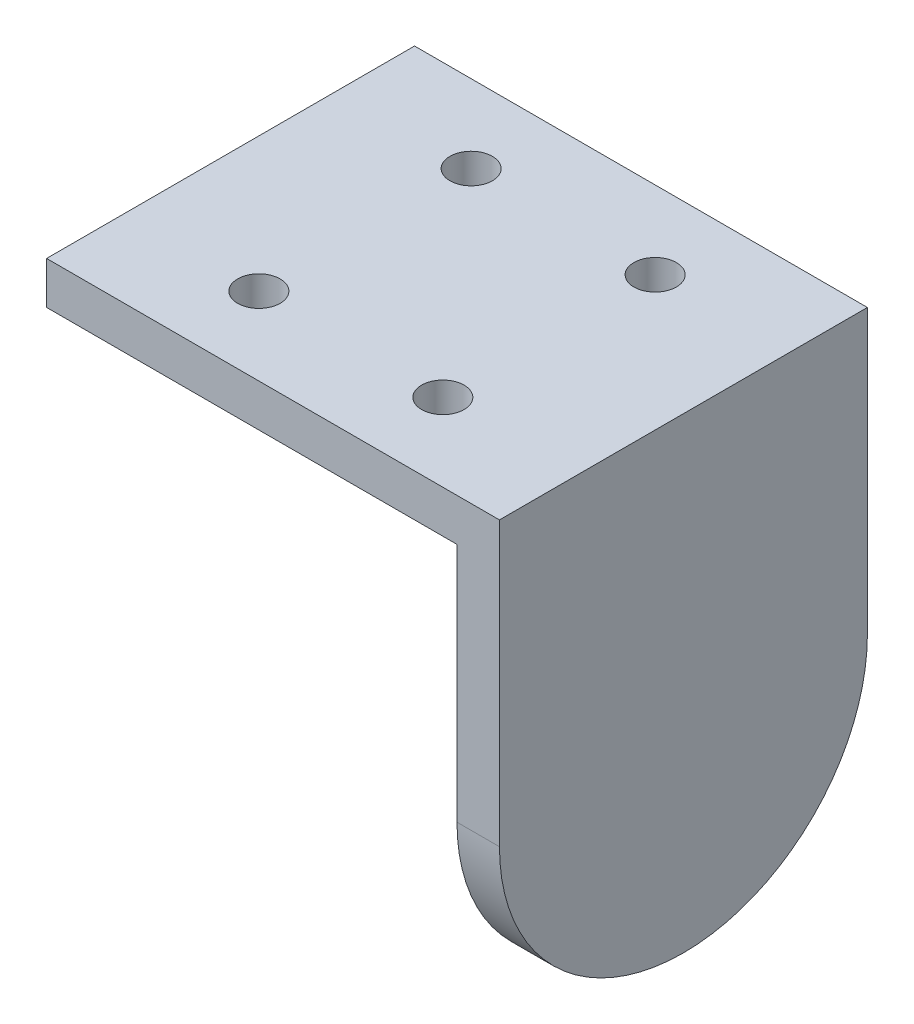
ISO-10303-21;
HEADER;
FILE_DESCRIPTION(('STEP AP214'),'2;1');
FILE_NAME('part.step','',(''),(''),'','','');
FILE_SCHEMA(('AUTOMOTIVE_DESIGN { 1 0 10303 214 1 1 1 1 }'));
ENDSEC;
DATA;
#1=APPLICATION_CONTEXT('core data for automotive mechanical design processes');
#2=APPLICATION_PROTOCOL_DEFINITION('international standard','automotive_design',2000,#1);
#3=PRODUCT_CONTEXT('',#1,'mechanical');
#4=PRODUCT('Part','Part','',(#3));
#5=PRODUCT_RELATED_PRODUCT_CATEGORY('part','',(#4));
#6=PRODUCT_DEFINITION_FORMATION('','',#4);
#7=PRODUCT_DEFINITION_CONTEXT('part definition',#1,'design');
#8=PRODUCT_DEFINITION('design','',#6,#7);
#9=PRODUCT_DEFINITION_SHAPE('','',#8);
#10=(LENGTH_UNIT() NAMED_UNIT(*) SI_UNIT(.MILLI.,.METRE.));
#11=(NAMED_UNIT(*) PLANE_ANGLE_UNIT() SI_UNIT($,.RADIAN.));
#12=(NAMED_UNIT(*) SI_UNIT($,.STERADIAN.) SOLID_ANGLE_UNIT());
#13=UNCERTAINTY_MEASURE_WITH_UNIT(LENGTH_MEASURE(1.E-05),#10,'distance_accuracy_value','');
#14=(GEOMETRIC_REPRESENTATION_CONTEXT(3) GLOBAL_UNCERTAINTY_ASSIGNED_CONTEXT((#13)) GLOBAL_UNIT_ASSIGNED_CONTEXT((#10,
#11,#12)) REPRESENTATION_CONTEXT('',''));
#15=CARTESIAN_POINT('',(0.,0.,0.));
#16=DIRECTION('',(0.,0.,1.));
#17=DIRECTION('',(1.,0.,0.));
#18=AXIS2_PLACEMENT_3D('',#15,#16,#17);
#19=CARTESIAN_POINT('',(0.,30.,26.));
#20=DIRECTION('',(1.,0.,0.));
#21=DIRECTION('',(0.,1.,0.));
#22=AXIS2_PLACEMENT_3D('',#19,#20,#21);
#23=PLANE('',#22);
#24=DIRECTION('',(0.,-1.,0.));
#25=VECTOR('',#24,1.);
#26=CARTESIAN_POINT('',(0.,30.,0.));
#27=LINE('',#26,#25);
#28=CARTESIAN_POINT('',(0.,30.,0.));
#29=VERTEX_POINT('',#28);
#30=CARTESIAN_POINT('',(0.,13.,0.));
#31=VERTEX_POINT('',#30);
#32=EDGE_CURVE('E121',#29,#31,#27,.T.);
#33=ORIENTED_EDGE('',*,*,#32,.T.);
#34=CARTESIAN_POINT('',(0.,13.,13.));
#35=DIRECTION('',(1.,0.,0.));
#36=DIRECTION('',(0.,1.,0.));
#37=AXIS2_PLACEMENT_3D('',#34,#35,#36);
#38=CIRCLE('',#37,13.);
#39=CARTESIAN_POINT('',(0.,0.,13.));
#40=VERTEX_POINT('',#39);
#41=EDGE_CURVE('E42',#31,#40,#38,.F.);
#42=ORIENTED_EDGE('',*,*,#41,.T.);
#43=CARTESIAN_POINT('',(0.,13.,13.));
#44=DIRECTION('',(1.,0.,0.));
#45=DIRECTION('',(0.,1.,0.));
#46=AXIS2_PLACEMENT_3D('',#43,#44,#45);
#47=CIRCLE('',#46,13.);
#48=CARTESIAN_POINT('',(0.,13.,26.));
#49=VERTEX_POINT('',#48);
#50=EDGE_CURVE('E49',#40,#49,#47,.F.);
#51=ORIENTED_EDGE('',*,*,#50,.T.);
#52=DIRECTION('',(0.,-1.,0.));
#53=VECTOR('',#52,1.);
#54=CARTESIAN_POINT('',(0.,30.,26.));
#55=LINE('',#54,#53);
#56=CARTESIAN_POINT('',(0.,30.,26.));
#57=VERTEX_POINT('',#56);
#58=EDGE_CURVE('E98',#57,#49,#55,.T.);
#59=ORIENTED_EDGE('',*,*,#58,.F.);
#60=DIRECTION('',(0.,0.,-1.));
#61=VECTOR('',#60,1.);
#62=CARTESIAN_POINT('',(0.,30.,26.));
#63=LINE('',#62,#61);
#64=EDGE_CURVE('E120',#57,#29,#63,.T.);
#65=ORIENTED_EDGE('',*,*,#64,.T.);
#66=EDGE_LOOP('',(#33,#42,#51,#59,#65));
#67=FACE_BOUND('',#66,.T.);
#68=ADVANCED_FACE('F33',(#67),#23,.F.);
#69=CARTESIAN_POINT('',(3.,0.,26.));
#70=DIRECTION('',(-1.,0.,0.));
#71=DIRECTION('',(0.,0.,1.));
#72=AXIS2_PLACEMENT_3D('',#69,#70,#71);
#73=PLANE('',#72);
#74=CARTESIAN_POINT('',(3.,13.,13.));
#75=DIRECTION('',(-1.,0.,0.));
#76=DIRECTION('',(0.,0.,1.));
#77=AXIS2_PLACEMENT_3D('',#74,#75,#76);
#78=CIRCLE('',#77,13.);
#79=CARTESIAN_POINT('',(3.,13.,26.));
#80=VERTEX_POINT('',#79);
#81=CARTESIAN_POINT('',(3.,0.,13.));
#82=VERTEX_POINT('',#81);
#83=EDGE_CURVE('E107',#80,#82,#78,.F.);
#84=ORIENTED_EDGE('',*,*,#83,.T.);
#85=CARTESIAN_POINT('',(3.,13.,13.));
#86=DIRECTION('',(-1.,0.,0.));
#87=DIRECTION('',(0.,0.,1.));
#88=AXIS2_PLACEMENT_3D('',#85,#86,#87);
#89=CIRCLE('',#88,13.);
#90=CARTESIAN_POINT('',(3.,13.,0.));
#91=VERTEX_POINT('',#90);
#92=EDGE_CURVE('E137',#82,#91,#89,.F.);
#93=ORIENTED_EDGE('',*,*,#92,.T.);
#94=DIRECTION('',(0.,1.,0.));
#95=VECTOR('',#94,1.);
#96=CARTESIAN_POINT('',(3.,0.,0.));
#97=LINE('',#96,#95);
#98=CARTESIAN_POINT('',(3.,33.,0.));
#99=VERTEX_POINT('',#98);
#100=EDGE_CURVE('E104',#91,#99,#97,.T.);
#101=ORIENTED_EDGE('',*,*,#100,.T.);
#102=DIRECTION('',(0.,0.,-1.));
#103=VECTOR('',#102,1.);
#104=CARTESIAN_POINT('',(3.,33.,26.));
#105=LINE('',#104,#103);
#106=CARTESIAN_POINT('',(3.,33.,26.));
#107=VERTEX_POINT('',#106);
#108=EDGE_CURVE('E101',#107,#99,#105,.T.);
#109=ORIENTED_EDGE('',*,*,#108,.F.);
#110=DIRECTION('',(0.,1.,0.));
#111=VECTOR('',#110,1.);
#112=CARTESIAN_POINT('',(3.,0.,26.));
#113=LINE('',#112,#111);
#114=EDGE_CURVE('E89',#80,#107,#113,.T.);
#115=ORIENTED_EDGE('',*,*,#114,.F.);
#116=EDGE_LOOP('',(#84,#93,#101,#109,#115));
#117=FACE_BOUND('',#116,.T.);
#118=ADVANCED_FACE('F102',(#117),#73,.F.);
#119=CARTESIAN_POINT('',(3.,33.,26.));
#120=DIRECTION('',(0.,-1.,0.));
#121=DIRECTION('',(0.,0.,-1.));
#122=AXIS2_PLACEMENT_3D('',#119,#120,#121);
#123=PLANE('',#122);
#124=CARTESIAN_POINT('',(-19.5,33.,20.5));
#125=DIRECTION('',(0.,1.,0.));
#126=DIRECTION('',(0.,0.,1.));
#127=AXIS2_PLACEMENT_3D('',#124,#125,#126);
#128=CIRCLE('',#127,1.5);
#129=CARTESIAN_POINT('',(-19.5,33.,22.));
#130=VERTEX_POINT('',#129);
#131=EDGE_CURVE('E175',#130,#130,#128,.T.);
#132=ORIENTED_EDGE('',*,*,#131,.F.);
#133=EDGE_LOOP('',(#132));
#134=FACE_BOUND('',#133,.T.);
#135=CARTESIAN_POINT('',(-6.5,33.,5.5));
#136=DIRECTION('',(0.,1.,0.));
#137=DIRECTION('',(0.,0.,1.));
#138=AXIS2_PLACEMENT_3D('',#135,#136,#137);
#139=CIRCLE('',#138,1.5);
#140=CARTESIAN_POINT('',(-6.5,33.,7.));
#141=VERTEX_POINT('',#140);
#142=EDGE_CURVE('E176',#141,#141,#139,.T.);
#143=ORIENTED_EDGE('',*,*,#142,.F.);
#144=EDGE_LOOP('',(#143));
#145=FACE_BOUND('',#144,.T.);
#146=CARTESIAN_POINT('',(-6.5,33.,20.5));
#147=DIRECTION('',(0.,1.,0.));
#148=DIRECTION('',(0.,0.,1.));
#149=AXIS2_PLACEMENT_3D('',#146,#147,#148);
#150=CIRCLE('',#149,1.5);
#151=CARTESIAN_POINT('',(-6.5,33.,22.));
#152=VERTEX_POINT('',#151);
#153=EDGE_CURVE('E186',#152,#152,#150,.T.);
#154=ORIENTED_EDGE('',*,*,#153,.F.);
#155=EDGE_LOOP('',(#154));
#156=FACE_BOUND('',#155,.T.);
#157=CARTESIAN_POINT('',(-19.5,33.,5.5));
#158=DIRECTION('',(0.,1.,0.));
#159=DIRECTION('',(0.,0.,1.));
#160=AXIS2_PLACEMENT_3D('',#157,#158,#159);
#161=CIRCLE('',#160,1.5);
#162=CARTESIAN_POINT('',(-19.5,33.,7.));
#163=VERTEX_POINT('',#162);
#164=EDGE_CURVE('E164',#163,#163,#161,.T.);
#165=ORIENTED_EDGE('',*,*,#164,.F.);
#166=EDGE_LOOP('',(#165));
#167=FACE_BOUND('',#166,.T.);
#168=DIRECTION('',(-1.,0.,0.));
#169=VECTOR('',#168,1.);
#170=CARTESIAN_POINT('',(3.,33.,0.));
#171=LINE('',#170,#169);
#172=CARTESIAN_POINT('',(-29.,33.,0.));
#173=VERTEX_POINT('',#172);
#174=EDGE_CURVE('E124',#99,#173,#171,.T.);
#175=ORIENTED_EDGE('',*,*,#174,.T.);
#176=DIRECTION('',(0.,0.,-1.));
#177=VECTOR('',#176,1.);
#178=CARTESIAN_POINT('',(-29.,33.,26.));
#179=LINE('',#178,#177);
#180=CARTESIAN_POINT('',(-29.,33.,26.));
#181=VERTEX_POINT('',#180);
#182=EDGE_CURVE('E108',#181,#173,#179,.T.);
#183=ORIENTED_EDGE('',*,*,#182,.F.);
#184=DIRECTION('',(-1.,0.,0.));
#185=VECTOR('',#184,1.);
#186=CARTESIAN_POINT('',(3.,33.,26.));
#187=LINE('',#186,#185);
#188=EDGE_CURVE('E93',#107,#181,#187,.T.);
#189=ORIENTED_EDGE('',*,*,#188,.F.);
#190=ORIENTED_EDGE('',*,*,#108,.T.);
#191=EDGE_LOOP('',(#175,#183,#189,#190));
#192=FACE_BOUND('',#191,.T.);
#193=ADVANCED_FACE('F110',(#134,#145,#156,#167,#192),#123,.F.);
#194=CARTESIAN_POINT('',(-29.,33.,26.));
#195=DIRECTION('',(1.,0.,0.));
#196=DIRECTION('',(0.,0.,-1.));
#197=AXIS2_PLACEMENT_3D('',#194,#195,#196);
#198=PLANE('',#197);
#199=DIRECTION('',(0.,-1.,0.));
#200=VECTOR('',#199,1.);
#201=CARTESIAN_POINT('',(-29.,33.,0.));
#202=LINE('',#201,#200);
#203=CARTESIAN_POINT('',(-29.,30.,0.));
#204=VERTEX_POINT('',#203);
#205=EDGE_CURVE('E126',#173,#204,#202,.T.);
#206=ORIENTED_EDGE('',*,*,#205,.T.);
#207=DIRECTION('',(0.,0.,-1.));
#208=VECTOR('',#207,1.);
#209=CARTESIAN_POINT('',(-29.,30.,26.));
#210=LINE('',#209,#208);
#211=CARTESIAN_POINT('',(-29.,30.,26.));
#212=VERTEX_POINT('',#211);
#213=EDGE_CURVE('E132',#212,#204,#210,.T.);
#214=ORIENTED_EDGE('',*,*,#213,.F.);
#215=DIRECTION('',(0.,-1.,0.));
#216=VECTOR('',#215,1.);
#217=CARTESIAN_POINT('',(-29.,33.,26.));
#218=LINE('',#217,#216);
#219=EDGE_CURVE('E113',#181,#212,#218,.T.);
#220=ORIENTED_EDGE('',*,*,#219,.F.);
#221=ORIENTED_EDGE('',*,*,#182,.T.);
#222=EDGE_LOOP('',(#206,#214,#220,#221));
#223=FACE_BOUND('',#222,.T.);
#224=ADVANCED_FACE('F157',(#223),#198,.F.);
#225=CARTESIAN_POINT('',(-29.,30.,26.));
#226=DIRECTION('',(0.,1.,0.));
#227=DIRECTION('',(0.,0.,1.));
#228=AXIS2_PLACEMENT_3D('',#225,#226,#227);
#229=PLANE('',#228);
#230=CARTESIAN_POINT('',(-19.5,30.,20.5));
#231=DIRECTION('',(0.,1.,0.));
#232=DIRECTION('',(0.,0.,1.));
#233=AXIS2_PLACEMENT_3D('',#230,#231,#232);
#234=CIRCLE('',#233,1.5);
#235=CARTESIAN_POINT('',(-19.5,30.,22.));
#236=VERTEX_POINT('',#235);
#237=EDGE_CURVE('E169',#236,#236,#234,.F.);
#238=ORIENTED_EDGE('',*,*,#237,.F.);
#239=EDGE_LOOP('',(#238));
#240=FACE_BOUND('',#239,.T.);
#241=CARTESIAN_POINT('',(-6.5,30.,5.5));
#242=DIRECTION('',(0.,1.,0.));
#243=DIRECTION('',(0.,0.,1.));
#244=AXIS2_PLACEMENT_3D('',#241,#242,#243);
#245=CIRCLE('',#244,1.5);
#246=CARTESIAN_POINT('',(-6.5,30.,7.));
#247=VERTEX_POINT('',#246);
#248=EDGE_CURVE('E172',#247,#247,#245,.F.);
#249=ORIENTED_EDGE('',*,*,#248,.F.);
#250=EDGE_LOOP('',(#249));
#251=FACE_BOUND('',#250,.T.);
#252=CARTESIAN_POINT('',(-6.5,30.,20.5));
#253=DIRECTION('',(0.,1.,0.));
#254=DIRECTION('',(0.,0.,1.));
#255=AXIS2_PLACEMENT_3D('',#252,#253,#254);
#256=CIRCLE('',#255,1.5);
#257=CARTESIAN_POINT('',(-6.5,30.,22.));
#258=VERTEX_POINT('',#257);
#259=EDGE_CURVE('E179',#258,#258,#256,.F.);
#260=ORIENTED_EDGE('',*,*,#259,.F.);
#261=EDGE_LOOP('',(#260));
#262=FACE_BOUND('',#261,.T.);
#263=CARTESIAN_POINT('',(-19.5,30.,5.5));
#264=DIRECTION('',(0.,1.,0.));
#265=DIRECTION('',(0.,0.,1.));
#266=AXIS2_PLACEMENT_3D('',#263,#264,#265);
#267=CIRCLE('',#266,1.5);
#268=CARTESIAN_POINT('',(-19.5,30.,7.));
#269=VERTEX_POINT('',#268);
#270=EDGE_CURVE('E162',#269,#269,#267,.F.);
#271=ORIENTED_EDGE('',*,*,#270,.F.);
#272=EDGE_LOOP('',(#271));
#273=FACE_BOUND('',#272,.T.);
#274=DIRECTION('',(1.,0.,0.));
#275=VECTOR('',#274,1.);
#276=CARTESIAN_POINT('',(-29.,30.,0.));
#277=LINE('',#276,#275);
#278=EDGE_CURVE('E128',#204,#29,#277,.T.);
#279=ORIENTED_EDGE('',*,*,#278,.T.);
#280=ORIENTED_EDGE('',*,*,#64,.F.);
#281=DIRECTION('',(1.,0.,0.));
#282=VECTOR('',#281,1.);
#283=CARTESIAN_POINT('',(-29.,30.,26.));
#284=LINE('',#283,#282);
#285=EDGE_CURVE('E115',#212,#57,#284,.T.);
#286=ORIENTED_EDGE('',*,*,#285,.F.);
#287=ORIENTED_EDGE('',*,*,#213,.T.);
#288=EDGE_LOOP('',(#279,#280,#286,#287));
#289=FACE_BOUND('',#288,.T.);
#290=ADVANCED_FACE('F153',(#240,#251,#262,#273,#289),#229,.F.);
#291=CARTESIAN_POINT('',(0.,0.,26.));
#292=DIRECTION('',(0.,0.,1.));
#293=DIRECTION('',(1.,0.,0.));
#294=AXIS2_PLACEMENT_3D('',#291,#292,#293);
#295=PLANE('',#294);
#296=ORIENTED_EDGE('',*,*,#58,.T.);
#297=DIRECTION('',(1.,0.,0.));
#298=VECTOR('',#297,1.);
#299=CARTESIAN_POINT('',(3.,13.,26.));
#300=LINE('',#299,#298);
#301=EDGE_CURVE('E11',#49,#80,#300,.T.);
#302=ORIENTED_EDGE('',*,*,#301,.T.);
#303=ORIENTED_EDGE('',*,*,#114,.T.);
#304=ORIENTED_EDGE('',*,*,#188,.T.);
#305=ORIENTED_EDGE('',*,*,#219,.T.);
#306=ORIENTED_EDGE('',*,*,#285,.T.);
#307=EDGE_LOOP('',(#296,#302,#303,#304,#305,#306));
#308=FACE_BOUND('',#307,.T.);
#309=ADVANCED_FACE('F91',(#308),#295,.T.);
#310=CARTESIAN_POINT('',(0.,0.,0.));
#311=DIRECTION('',(0.,0.,1.));
#312=DIRECTION('',(1.,0.,0.));
#313=AXIS2_PLACEMENT_3D('',#310,#311,#312);
#314=PLANE('',#313);
#315=ORIENTED_EDGE('',*,*,#100,.F.);
#316=DIRECTION('',(1.,0.,0.));
#317=VECTOR('',#316,1.);
#318=CARTESIAN_POINT('',(0.,13.,0.));
#319=LINE('',#318,#317);
#320=EDGE_CURVE('E139',#91,#31,#319,.F.);
#321=ORIENTED_EDGE('',*,*,#320,.T.);
#322=ORIENTED_EDGE('',*,*,#32,.F.);
#323=ORIENTED_EDGE('',*,*,#278,.F.);
#324=ORIENTED_EDGE('',*,*,#205,.F.);
#325=ORIENTED_EDGE('',*,*,#174,.F.);
#326=EDGE_LOOP('',(#315,#321,#322,#323,#324,#325));
#327=FACE_BOUND('',#326,.T.);
#328=ADVANCED_FACE('F146',(#327),#314,.F.);
#329=CARTESIAN_POINT('',(0.,13.,13.));
#330=DIRECTION('',(-1.,0.,0.));
#331=DIRECTION('',(0.,0.,1.));
#332=AXIS2_PLACEMENT_3D('',#329,#330,#331);
#333=CYLINDRICAL_SURFACE('',#332,13.);
#334=ORIENTED_EDGE('',*,*,#301,.F.);
#335=ORIENTED_EDGE('',*,*,#50,.F.);
#336=DIRECTION('',(1.,0.,0.));
#337=VECTOR('',#336,1.);
#338=CARTESIAN_POINT('',(0.,0.,13.));
#339=LINE('',#338,#337);
#340=EDGE_CURVE('E37',#82,#40,#339,.F.);
#341=ORIENTED_EDGE('',*,*,#340,.F.);
#342=ORIENTED_EDGE('',*,*,#83,.F.);
#343=EDGE_LOOP('',(#334,#335,#341,#342));
#344=FACE_BOUND('',#343,.T.);
#345=ADVANCED_FACE('F35',(#344),#333,.T.);
#346=CARTESIAN_POINT('',(0.,13.,13.));
#347=DIRECTION('',(1.,0.,0.));
#348=DIRECTION('',(0.,0.,-1.));
#349=AXIS2_PLACEMENT_3D('',#346,#347,#348);
#350=CYLINDRICAL_SURFACE('',#349,13.);
#351=ORIENTED_EDGE('',*,*,#41,.F.);
#352=ORIENTED_EDGE('',*,*,#320,.F.);
#353=ORIENTED_EDGE('',*,*,#92,.F.);
#354=ORIENTED_EDGE('',*,*,#340,.T.);
#355=EDGE_LOOP('',(#351,#352,#353,#354));
#356=FACE_BOUND('',#355,.T.);
#357=ADVANCED_FACE('F161',(#356),#350,.T.);
#358=CARTESIAN_POINT('',(-19.5,-0.001000000000001,5.5));
#359=DIRECTION('',(0.,1.,0.));
#360=DIRECTION('',(0.,0.,1.));
#361=AXIS2_PLACEMENT_3D('',#358,#359,#360);
#362=CYLINDRICAL_SURFACE('',#361,1.5);
#363=ORIENTED_EDGE('',*,*,#164,.T.);
#364=EDGE_LOOP('',(#363));
#365=FACE_BOUND('',#364,.T.);
#366=ORIENTED_EDGE('',*,*,#270,.T.);
#367=EDGE_LOOP('',(#366));
#368=FACE_BOUND('',#367,.T.);
#369=ADVANCED_FACE('F199',(#365,#368),#362,.F.);
#370=CARTESIAN_POINT('',(-6.5,-0.001000000000001,20.5));
#371=DIRECTION('',(0.,1.,0.));
#372=DIRECTION('',(0.,0.,1.));
#373=AXIS2_PLACEMENT_3D('',#370,#371,#372);
#374=CYLINDRICAL_SURFACE('',#373,1.5);
#375=ORIENTED_EDGE('',*,*,#153,.T.);
#376=EDGE_LOOP('',(#375));
#377=FACE_BOUND('',#376,.T.);
#378=ORIENTED_EDGE('',*,*,#259,.T.);
#379=EDGE_LOOP('',(#378));
#380=FACE_BOUND('',#379,.T.);
#381=ADVANCED_FACE('F190',(#377,#380),#374,.F.);
#382=CARTESIAN_POINT('',(-6.5,-0.001000000000001,5.5));
#383=DIRECTION('',(0.,1.,0.));
#384=DIRECTION('',(0.,0.,1.));
#385=AXIS2_PLACEMENT_3D('',#382,#383,#384);
#386=CYLINDRICAL_SURFACE('',#385,1.5);
#387=ORIENTED_EDGE('',*,*,#142,.T.);
#388=EDGE_LOOP('',(#387));
#389=FACE_BOUND('',#388,.T.);
#390=ORIENTED_EDGE('',*,*,#248,.T.);
#391=EDGE_LOOP('',(#390));
#392=FACE_BOUND('',#391,.T.);
#393=ADVANCED_FACE('F206',(#389,#392),#386,.F.);
#394=CARTESIAN_POINT('',(-19.5,-0.001000000000001,20.5));
#395=DIRECTION('',(0.,1.,0.));
#396=DIRECTION('',(0.,0.,1.));
#397=AXIS2_PLACEMENT_3D('',#394,#395,#396);
#398=CYLINDRICAL_SURFACE('',#397,1.5);
#399=ORIENTED_EDGE('',*,*,#131,.T.);
#400=EDGE_LOOP('',(#399));
#401=FACE_BOUND('',#400,.T.);
#402=ORIENTED_EDGE('',*,*,#237,.T.);
#403=EDGE_LOOP('',(#402));
#404=FACE_BOUND('',#403,.T.);
#405=ADVANCED_FACE('F273',(#401,#404),#398,.F.);
#406=CLOSED_SHELL('',(#68,#118,#193,#224,#290,#309,#328,#345,#357,#369,#381,#393,#405));
#407=MANIFOLD_SOLID_BREP('B2',#406);
#408=ADVANCED_BREP_SHAPE_REPRESENTATION('',(#18,#407),#14);
#409=SHAPE_DEFINITION_REPRESENTATION(#9,#408);
ENDSEC;
END-ISO-10303-21;
